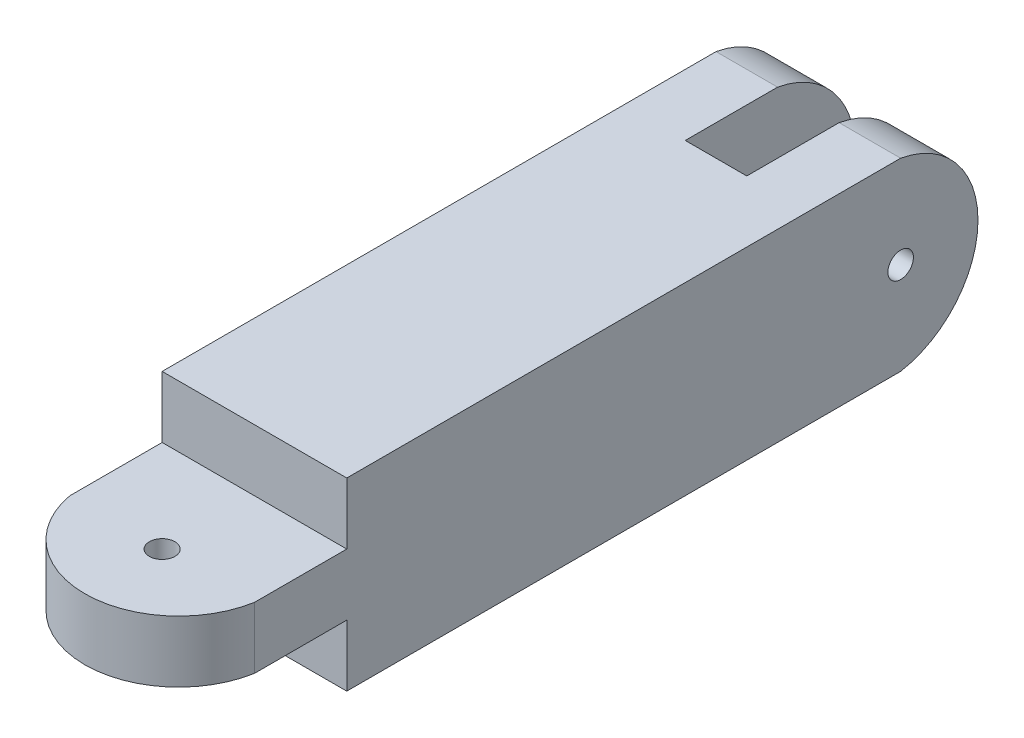
ISO-10303-21;
HEADER;
FILE_DESCRIPTION(('STEP AP214'),'2;1');
FILE_NAME('part.step','',(''),(''),'','','');
FILE_SCHEMA(('AUTOMOTIVE_DESIGN { 1 0 10303 214 1 1 1 1 }'));
ENDSEC;
DATA;
#1=APPLICATION_CONTEXT('core data for automotive mechanical design processes');
#2=APPLICATION_PROTOCOL_DEFINITION('international standard','automotive_design',2000,#1);
#3=PRODUCT_CONTEXT('',#1,'mechanical');
#4=PRODUCT('Part','Part','',(#3));
#5=PRODUCT_RELATED_PRODUCT_CATEGORY('part','',(#4));
#6=PRODUCT_DEFINITION_FORMATION('','',#4);
#7=PRODUCT_DEFINITION_CONTEXT('part definition',#1,'design');
#8=PRODUCT_DEFINITION('design','',#6,#7);
#9=PRODUCT_DEFINITION_SHAPE('','',#8);
#10=(LENGTH_UNIT() NAMED_UNIT(*) SI_UNIT(.MILLI.,.METRE.));
#11=(NAMED_UNIT(*) PLANE_ANGLE_UNIT() SI_UNIT($,.RADIAN.));
#12=(NAMED_UNIT(*) SI_UNIT($,.STERADIAN.) SOLID_ANGLE_UNIT());
#13=UNCERTAINTY_MEASURE_WITH_UNIT(LENGTH_MEASURE(1.E-05),#10,'distance_accuracy_value','');
#14=(GEOMETRIC_REPRESENTATION_CONTEXT(3) GLOBAL_UNCERTAINTY_ASSIGNED_CONTEXT((#13)) GLOBAL_UNIT_ASSIGNED_CONTEXT((#10,
#11,#12)) REPRESENTATION_CONTEXT('',''));
#15=CARTESIAN_POINT('',(0.,0.,0.));
#16=DIRECTION('',(0.,0.,1.));
#17=DIRECTION('',(1.,0.,0.));
#18=AXIS2_PLACEMENT_3D('',#15,#16,#17);
#19=CARTESIAN_POINT('',(0.,0.,150.));
#20=DIRECTION('',(0.,0.,1.));
#21=DIRECTION('',(1.,0.,0.));
#22=AXIS2_PLACEMENT_3D('',#19,#20,#21);
#23=PLANE('',#22);
#24=DIRECTION('',(1.,0.,0.));
#25=VECTOR('',#24,1.);
#26=CARTESIAN_POINT('',(-30.,-10.,150.));
#27=LINE('',#26,#25);
#28=CARTESIAN_POINT('',(-30.,-10.,150.));
#29=VERTEX_POINT('',#28);
#30=CARTESIAN_POINT('',(30.,-10.,150.));
#31=VERTEX_POINT('',#30);
#32=EDGE_CURVE('E56',#29,#31,#27,.T.);
#33=ORIENTED_EDGE('',*,*,#32,.F.);
#34=DIRECTION('',(0.,-1.,0.));
#35=VECTOR('',#34,1.);
#36=CARTESIAN_POINT('',(-30.,30.,150.));
#37=LINE('',#36,#35);
#38=CARTESIAN_POINT('',(-30.,-30.,150.));
#39=VERTEX_POINT('',#38);
#40=EDGE_CURVE('E310',#29,#39,#37,.T.);
#41=ORIENTED_EDGE('',*,*,#40,.T.);
#42=DIRECTION('',(1.,0.,0.));
#43=VECTOR('',#42,1.);
#44=CARTESIAN_POINT('',(-30.,-30.,150.));
#45=LINE('',#44,#43);
#46=CARTESIAN_POINT('',(30.,-30.,150.));
#47=VERTEX_POINT('',#46);
#48=EDGE_CURVE('E314',#39,#47,#45,.T.);
#49=ORIENTED_EDGE('',*,*,#48,.T.);
#50=DIRECTION('',(0.,1.,0.));
#51=VECTOR('',#50,1.);
#52=CARTESIAN_POINT('',(30.,30.,150.));
#53=LINE('',#52,#51);
#54=EDGE_CURVE('E303',#47,#31,#53,.T.);
#55=ORIENTED_EDGE('',*,*,#54,.T.);
#56=EDGE_LOOP('',(#33,#41,#49,#55));
#57=FACE_BOUND('',#56,.T.);
#58=ADVANCED_FACE('F40',(#57),#23,.T.);
#59=CARTESIAN_POINT('',(0.,0.,0.));
#60=DIRECTION('',(0.,0.,1.));
#61=DIRECTION('',(1.,0.,0.));
#62=AXIS2_PLACEMENT_3D('',#59,#60,#61);
#63=PLANE('',#62);
#64=DIRECTION('',(0.,1.,0.));
#65=VECTOR('',#64,1.);
#66=CARTESIAN_POINT('',(9.99999999999999,30.,0.));
#67=LINE('',#66,#65);
#68=CARTESIAN_POINT('',(9.99999999999998,-30.,0.));
#69=VERTEX_POINT('',#68);
#70=CARTESIAN_POINT('',(9.99999999999999,30.,0.));
#71=VERTEX_POINT('',#70);
#72=EDGE_CURVE('E261',#69,#71,#67,.T.);
#73=ORIENTED_EDGE('',*,*,#72,.F.);
#74=DIRECTION('',(1.,0.,0.));
#75=VECTOR('',#74,1.);
#76=CARTESIAN_POINT('',(-30.,-30.,0.));
#77=LINE('',#76,#75);
#78=CARTESIAN_POINT('',(-10.,-30.,0.));
#79=VERTEX_POINT('',#78);
#80=EDGE_CURVE('E320',#79,#69,#77,.T.);
#81=ORIENTED_EDGE('',*,*,#80,.F.);
#82=DIRECTION('',(0.,-1.,0.));
#83=VECTOR('',#82,1.);
#84=CARTESIAN_POINT('',(-10.,-30.,0.));
#85=LINE('',#84,#83);
#86=CARTESIAN_POINT('',(-10.,30.,0.));
#87=VERTEX_POINT('',#86);
#88=EDGE_CURVE('E282',#87,#79,#85,.T.);
#89=ORIENTED_EDGE('',*,*,#88,.F.);
#90=DIRECTION('',(-1.,0.,0.));
#91=VECTOR('',#90,1.);
#92=CARTESIAN_POINT('',(-30.,30.,0.));
#93=LINE('',#92,#91);
#94=EDGE_CURVE('E302',#71,#87,#93,.T.);
#95=ORIENTED_EDGE('',*,*,#94,.F.);
#96=EDGE_LOOP('',(#73,#81,#89,#95));
#97=FACE_BOUND('',#96,.T.);
#98=ADVANCED_FACE('F375',(#97),#63,.F.);
#99=CARTESIAN_POINT('',(30.,30.,150.));
#100=DIRECTION('',(-1.,0.,0.));
#101=DIRECTION('',(0.,-1.,0.));
#102=AXIS2_PLACEMENT_3D('',#99,#100,#101);
#103=PLANE('',#102);
#104=CARTESIAN_POINT('',(30.,0.,-30.));
#105=DIRECTION('',(-1.,0.,0.));
#106=DIRECTION('',(0.,-1.,0.));
#107=AXIS2_PLACEMENT_3D('',#104,#105,#106);
#108=CIRCLE('',#107,4.15);
#109=CARTESIAN_POINT('',(30.,-4.15,-30.));
#110=VERTEX_POINT('',#109);
#111=EDGE_CURVE('E408',#110,#110,#108,.T.);
#112=ORIENTED_EDGE('',*,*,#111,.T.);
#113=EDGE_LOOP('',(#112));
#114=FACE_BOUND('',#113,.T.);
#115=DIRECTION('',(0.,0.,-1.));
#116=VECTOR('',#115,1.);
#117=CARTESIAN_POINT('',(30.,-30.,150.));
#118=LINE('',#117,#116);
#119=CARTESIAN_POINT('',(30.,-30.,-30.));
#120=VERTEX_POINT('',#119);
#121=EDGE_CURVE('E317',#47,#120,#118,.T.);
#122=ORIENTED_EDGE('',*,*,#121,.T.);
#123=CARTESIAN_POINT('',(30.,0.,-24.6688744152853));
#124=DIRECTION('',(1.,0.,0.));
#125=DIRECTION('',(0.,-1.,0.));
#126=AXIS2_PLACEMENT_3D('',#123,#124,#125);
#127=CIRCLE('',#126,30.47);
#128=CARTESIAN_POINT('',(30.,30.,-30.));
#129=VERTEX_POINT('',#128);
#130=EDGE_CURVE('E253',#120,#129,#127,.T.);
#131=ORIENTED_EDGE('',*,*,#130,.T.);
#132=DIRECTION('',(0.,0.,-1.));
#133=VECTOR('',#132,1.);
#134=CARTESIAN_POINT('',(30.,30.,150.));
#135=LINE('',#134,#133);
#136=CARTESIAN_POINT('',(30.,30.,150.));
#137=VERTEX_POINT('',#136);
#138=EDGE_CURVE('E11',#137,#129,#135,.T.);
#139=ORIENTED_EDGE('',*,*,#138,.F.);
#140=CARTESIAN_POINT('',(30.,10.,150.));
#141=VERTEX_POINT('',#140);
#142=EDGE_CURVE('E307',#141,#137,#53,.T.);
#143=ORIENTED_EDGE('',*,*,#142,.F.);
#144=DIRECTION('',(0.,0.,-1.));
#145=VECTOR('',#144,1.);
#146=CARTESIAN_POINT('',(30.,10.,180.));
#147=LINE('',#146,#145);
#148=CARTESIAN_POINT('',(30.,10.,180.));
#149=VERTEX_POINT('',#148);
#150=EDGE_CURVE('E244',#149,#141,#147,.T.);
#151=ORIENTED_EDGE('',*,*,#150,.F.);
#152=DIRECTION('',(0.,1.,0.));
#153=VECTOR('',#152,1.);
#154=CARTESIAN_POINT('',(30.,10.,180.));
#155=LINE('',#154,#153);
#156=CARTESIAN_POINT('',(30.,-10.,180.));
#157=VERTEX_POINT('',#156);
#158=EDGE_CURVE('E220',#157,#149,#155,.T.);
#159=ORIENTED_EDGE('',*,*,#158,.F.);
#160=DIRECTION('',(0.,0.,-1.));
#161=VECTOR('',#160,1.);
#162=CARTESIAN_POINT('',(30.,-10.,180.));
#163=LINE('',#162,#161);
#164=EDGE_CURVE('E228',#157,#31,#163,.T.);
#165=ORIENTED_EDGE('',*,*,#164,.T.);
#166=ORIENTED_EDGE('',*,*,#54,.F.);
#167=EDGE_LOOP('',(#122,#131,#139,#143,#151,#159,#165,#166));
#168=FACE_BOUND('',#167,.T.);
#169=ADVANCED_FACE('F42',(#114,#168),#103,.F.);
#170=CARTESIAN_POINT('',(-30.,30.,150.));
#171=DIRECTION('',(0.,-1.,0.));
#172=DIRECTION('',(0.,0.,-1.));
#173=AXIS2_PLACEMENT_3D('',#170,#171,#172);
#174=PLANE('',#173);
#175=ORIENTED_EDGE('',*,*,#138,.T.);
#176=DIRECTION('',(1.,0.,0.));
#177=VECTOR('',#176,1.);
#178=CARTESIAN_POINT('',(30.,30.,-30.));
#179=LINE('',#178,#177);
#180=CARTESIAN_POINT('',(9.99999999999999,30.,-30.));
#181=VERTEX_POINT('',#180);
#182=EDGE_CURVE('E269',#181,#129,#179,.T.);
#183=ORIENTED_EDGE('',*,*,#182,.F.);
#184=DIRECTION('',(0.,0.,1.));
#185=VECTOR('',#184,1.);
#186=CARTESIAN_POINT('',(9.99999999999999,30.,-30.));
#187=LINE('',#186,#185);
#188=EDGE_CURVE('E273',#181,#71,#187,.T.);
#189=ORIENTED_EDGE('',*,*,#188,.T.);
#190=ORIENTED_EDGE('',*,*,#94,.T.);
#191=DIRECTION('',(0.,0.,1.));
#192=VECTOR('',#191,1.);
#193=CARTESIAN_POINT('',(-10.,30.,-30.));
#194=LINE('',#193,#192);
#195=CARTESIAN_POINT('',(-10.,30.,-30.));
#196=VERTEX_POINT('',#195);
#197=EDGE_CURVE('E298',#196,#87,#194,.T.);
#198=ORIENTED_EDGE('',*,*,#197,.F.);
#199=DIRECTION('',(1.,0.,0.));
#200=VECTOR('',#199,1.);
#201=CARTESIAN_POINT('',(-30.,30.,-30.));
#202=LINE('',#201,#200);
#203=CARTESIAN_POINT('',(-30.,30.,-30.));
#204=VERTEX_POINT('',#203);
#205=EDGE_CURVE('E283',#204,#196,#202,.T.);
#206=ORIENTED_EDGE('',*,*,#205,.F.);
#207=DIRECTION('',(0.,0.,-1.));
#208=VECTOR('',#207,1.);
#209=CARTESIAN_POINT('',(-30.,30.,150.));
#210=LINE('',#209,#208);
#211=CARTESIAN_POINT('',(-30.,30.,150.));
#212=VERTEX_POINT('',#211);
#213=EDGE_CURVE('E49',#212,#204,#210,.T.);
#214=ORIENTED_EDGE('',*,*,#213,.F.);
#215=DIRECTION('',(-1.,0.,0.));
#216=VECTOR('',#215,1.);
#217=CARTESIAN_POINT('',(-30.,30.,150.));
#218=LINE('',#217,#216);
#219=EDGE_CURVE('E306',#137,#212,#218,.T.);
#220=ORIENTED_EDGE('',*,*,#219,.F.);
#221=EDGE_LOOP('',(#175,#183,#189,#190,#198,#206,#214,#220));
#222=FACE_BOUND('',#221,.T.);
#223=ADVANCED_FACE('F362',(#222),#174,.F.);
#224=CARTESIAN_POINT('',(-30.,30.,150.));
#225=DIRECTION('',(1.,0.,0.));
#226=DIRECTION('',(0.,1.,0.));
#227=AXIS2_PLACEMENT_3D('',#224,#225,#226);
#228=PLANE('',#227);
#229=CARTESIAN_POINT('',(-30.,0.,-30.));
#230=DIRECTION('',(1.,0.,0.));
#231=DIRECTION('',(0.,1.,0.));
#232=AXIS2_PLACEMENT_3D('',#229,#230,#231);
#233=CIRCLE('',#232,4.15);
#234=CARTESIAN_POINT('',(-30.,4.15,-30.));
#235=VERTEX_POINT('',#234);
#236=EDGE_CURVE('E417',#235,#235,#233,.T.);
#237=ORIENTED_EDGE('',*,*,#236,.T.);
#238=EDGE_LOOP('',(#237));
#239=FACE_BOUND('',#238,.T.);
#240=ORIENTED_EDGE('',*,*,#213,.T.);
#241=CARTESIAN_POINT('',(-30.,0.,-24.6688744152853));
#242=DIRECTION('',(-1.,0.,0.));
#243=DIRECTION('',(0.,1.,0.));
#244=AXIS2_PLACEMENT_3D('',#241,#242,#243);
#245=CIRCLE('',#244,30.47);
#246=CARTESIAN_POINT('',(-30.,-30.,-30.));
#247=VERTEX_POINT('',#246);
#248=EDGE_CURVE('E248',#204,#247,#245,.T.);
#249=ORIENTED_EDGE('',*,*,#248,.T.);
#250=DIRECTION('',(0.,0.,-1.));
#251=VECTOR('',#250,1.);
#252=CARTESIAN_POINT('',(-30.,-30.,150.));
#253=LINE('',#252,#251);
#254=EDGE_CURVE('E327',#39,#247,#253,.T.);
#255=ORIENTED_EDGE('',*,*,#254,.F.);
#256=ORIENTED_EDGE('',*,*,#40,.F.);
#257=DIRECTION('',(0.,0.,-1.));
#258=VECTOR('',#257,1.);
#259=CARTESIAN_POINT('',(-30.,-10.,180.));
#260=LINE('',#259,#258);
#261=CARTESIAN_POINT('',(-30.,-10.,180.));
#262=VERTEX_POINT('',#261);
#263=EDGE_CURVE('E236',#262,#29,#260,.T.);
#264=ORIENTED_EDGE('',*,*,#263,.F.);
#265=DIRECTION('',(0.,-1.,0.));
#266=VECTOR('',#265,1.);
#267=CARTESIAN_POINT('',(-30.,10.,180.));
#268=LINE('',#267,#266);
#269=CARTESIAN_POINT('',(-30.,10.,180.));
#270=VERTEX_POINT('',#269);
#271=EDGE_CURVE('E224',#270,#262,#268,.T.);
#272=ORIENTED_EDGE('',*,*,#271,.F.);
#273=DIRECTION('',(0.,0.,-1.));
#274=VECTOR('',#273,1.);
#275=CARTESIAN_POINT('',(-30.,10.,180.));
#276=LINE('',#275,#274);
#277=CARTESIAN_POINT('',(-30.,10.,150.));
#278=VERTEX_POINT('',#277);
#279=EDGE_CURVE('E240',#270,#278,#276,.T.);
#280=ORIENTED_EDGE('',*,*,#279,.T.);
#281=EDGE_CURVE('E311',#212,#278,#37,.T.);
#282=ORIENTED_EDGE('',*,*,#281,.F.);
#283=EDGE_LOOP('',(#240,#249,#255,#256,#264,#272,#280,#282));
#284=FACE_BOUND('',#283,.T.);
#285=ADVANCED_FACE('F335',(#239,#284),#228,.F.);
#286=CARTESIAN_POINT('',(-30.,-30.,150.));
#287=DIRECTION('',(0.,1.,0.));
#288=DIRECTION('',(0.,0.,1.));
#289=AXIS2_PLACEMENT_3D('',#286,#287,#288);
#290=PLANE('',#289);
#291=ORIENTED_EDGE('',*,*,#254,.T.);
#292=DIRECTION('',(-1.,0.,0.));
#293=VECTOR('',#292,1.);
#294=CARTESIAN_POINT('',(-30.,-30.,-30.));
#295=LINE('',#294,#293);
#296=CARTESIAN_POINT('',(-10.,-30.,-30.));
#297=VERTEX_POINT('',#296);
#298=EDGE_CURVE('E287',#297,#247,#295,.T.);
#299=ORIENTED_EDGE('',*,*,#298,.F.);
#300=DIRECTION('',(0.,0.,1.));
#301=VECTOR('',#300,1.);
#302=CARTESIAN_POINT('',(-10.,-30.,-30.));
#303=LINE('',#302,#301);
#304=EDGE_CURVE('E291',#297,#79,#303,.T.);
#305=ORIENTED_EDGE('',*,*,#304,.T.);
#306=ORIENTED_EDGE('',*,*,#80,.T.);
#307=DIRECTION('',(0.,0.,1.));
#308=VECTOR('',#307,1.);
#309=CARTESIAN_POINT('',(9.99999999999998,-30.,-30.));
#310=LINE('',#309,#308);
#311=CARTESIAN_POINT('',(9.99999999999998,-30.,-30.));
#312=VERTEX_POINT('',#311);
#313=EDGE_CURVE('E279',#312,#69,#310,.T.);
#314=ORIENTED_EDGE('',*,*,#313,.F.);
#315=DIRECTION('',(-1.,0.,0.));
#316=VECTOR('',#315,1.);
#317=CARTESIAN_POINT('',(30.,-30.,-30.));
#318=LINE('',#317,#316);
#319=EDGE_CURVE('E265',#120,#312,#318,.T.);
#320=ORIENTED_EDGE('',*,*,#319,.F.);
#321=ORIENTED_EDGE('',*,*,#121,.F.);
#322=ORIENTED_EDGE('',*,*,#48,.F.);
#323=EDGE_LOOP('',(#291,#299,#305,#306,#314,#320,#321,#322));
#324=FACE_BOUND('',#323,.T.);
#325=ADVANCED_FACE('F344',(#324),#290,.F.);
#326=DIRECTION('',(-1.,0.,0.));
#327=VECTOR('',#326,1.);
#328=CARTESIAN_POINT('',(-30.,10.,150.));
#329=LINE('',#328,#327);
#330=EDGE_CURVE('E64',#141,#278,#329,.T.);
#331=ORIENTED_EDGE('',*,*,#330,.F.);
#332=ORIENTED_EDGE('',*,*,#142,.T.);
#333=ORIENTED_EDGE('',*,*,#219,.T.);
#334=ORIENTED_EDGE('',*,*,#281,.T.);
#335=EDGE_LOOP('',(#331,#332,#333,#334));
#336=FACE_BOUND('',#335,.T.);
#337=ADVANCED_FACE('F361',(#336),#23,.T.);
#338=CARTESIAN_POINT('',(-10.,-30.,-30.));
#339=DIRECTION('',(-1.,0.,0.));
#340=DIRECTION('',(0.,-1.,0.));
#341=AXIS2_PLACEMENT_3D('',#338,#339,#340);
#342=PLANE('',#341);
#343=CARTESIAN_POINT('',(-10.,0.,-30.));
#344=DIRECTION('',(1.,0.,0.));
#345=DIRECTION('',(0.,1.,0.));
#346=AXIS2_PLACEMENT_3D('',#343,#344,#345);
#347=CIRCLE('',#346,4.15);
#348=CARTESIAN_POINT('',(-10.,4.15,-30.));
#349=VERTEX_POINT('',#348);
#350=EDGE_CURVE('E420',#349,#349,#347,.T.);
#351=ORIENTED_EDGE('',*,*,#350,.F.);
#352=EDGE_LOOP('',(#351));
#353=FACE_BOUND('',#352,.T.);
#354=ORIENTED_EDGE('',*,*,#88,.T.);
#355=ORIENTED_EDGE('',*,*,#304,.F.);
#356=CARTESIAN_POINT('',(-10.,0.,-24.6688744152853));
#357=DIRECTION('',(-1.,0.,0.));
#358=DIRECTION('',(0.,1.,0.));
#359=AXIS2_PLACEMENT_3D('',#356,#357,#358);
#360=CIRCLE('',#359,30.47);
#361=EDGE_CURVE('E249',#196,#297,#360,.T.);
#362=ORIENTED_EDGE('',*,*,#361,.F.);
#363=ORIENTED_EDGE('',*,*,#197,.T.);
#364=EDGE_LOOP('',(#354,#355,#362,#363));
#365=FACE_BOUND('',#364,.T.);
#366=ADVANCED_FACE('F377',(#353,#365),#342,.F.);
#367=CARTESIAN_POINT('',(9.99999999999999,30.,-30.));
#368=DIRECTION('',(1.,0.,0.));
#369=DIRECTION('',(0.,1.,0.));
#370=AXIS2_PLACEMENT_3D('',#367,#368,#369);
#371=PLANE('',#370);
#372=CARTESIAN_POINT('',(9.99999999999999,0.,-30.));
#373=DIRECTION('',(-1.,0.,0.));
#374=DIRECTION('',(0.,-1.,0.));
#375=AXIS2_PLACEMENT_3D('',#372,#373,#374);
#376=CIRCLE('',#375,4.15);
#377=CARTESIAN_POINT('',(9.99999999999999,-4.15,-30.));
#378=VERTEX_POINT('',#377);
#379=EDGE_CURVE('E411',#378,#378,#376,.T.);
#380=ORIENTED_EDGE('',*,*,#379,.F.);
#381=EDGE_LOOP('',(#380));
#382=FACE_BOUND('',#381,.T.);
#383=ORIENTED_EDGE('',*,*,#72,.T.);
#384=ORIENTED_EDGE('',*,*,#188,.F.);
#385=CARTESIAN_POINT('',(10.,0.,-24.6688744152853));
#386=DIRECTION('',(1.,0.,0.));
#387=DIRECTION('',(0.,-1.,0.));
#388=AXIS2_PLACEMENT_3D('',#385,#386,#387);
#389=CIRCLE('',#388,30.47);
#390=EDGE_CURVE('E257',#312,#181,#389,.T.);
#391=ORIENTED_EDGE('',*,*,#390,.F.);
#392=ORIENTED_EDGE('',*,*,#313,.T.);
#393=EDGE_LOOP('',(#383,#384,#391,#392));
#394=FACE_BOUND('',#393,.T.);
#395=ADVANCED_FACE('F370',(#382,#394),#371,.F.);
#396=CARTESIAN_POINT('',(10.,0.,-24.6688744152853));
#397=DIRECTION('',(1.,0.,0.));
#398=DIRECTION('',(0.,1.,0.));
#399=AXIS2_PLACEMENT_3D('',#396,#397,#398);
#400=CYLINDRICAL_SURFACE('',#399,30.47);
#401=ORIENTED_EDGE('',*,*,#130,.F.);
#402=ORIENTED_EDGE('',*,*,#319,.T.);
#403=ORIENTED_EDGE('',*,*,#390,.T.);
#404=ORIENTED_EDGE('',*,*,#182,.T.);
#405=EDGE_LOOP('',(#401,#402,#403,#404));
#406=FACE_BOUND('',#405,.T.);
#407=ADVANCED_FACE('F366',(#406),#400,.T.);
#408=CARTESIAN_POINT('',(-10.,0.,-24.6688744152853));
#409=DIRECTION('',(-1.,0.,0.));
#410=DIRECTION('',(0.,-1.,0.));
#411=AXIS2_PLACEMENT_3D('',#408,#409,#410);
#412=CYLINDRICAL_SURFACE('',#411,30.47);
#413=ORIENTED_EDGE('',*,*,#248,.F.);
#414=ORIENTED_EDGE('',*,*,#205,.T.);
#415=ORIENTED_EDGE('',*,*,#361,.T.);
#416=ORIENTED_EDGE('',*,*,#298,.T.);
#417=EDGE_LOOP('',(#413,#414,#415,#416));
#418=FACE_BOUND('',#417,.T.);
#419=ADVANCED_FACE('F340',(#418),#412,.T.);
#420=CARTESIAN_POINT('',(-30.,10.,180.));
#421=DIRECTION('',(0.,-1.,0.));
#422=DIRECTION('',(0.,0.,-1.));
#423=AXIS2_PLACEMENT_3D('',#420,#421,#422);
#424=PLANE('',#423);
#425=CARTESIAN_POINT('',(0.,9.99999999999999,180.));
#426=DIRECTION('',(0.,-1.,0.));
#427=DIRECTION('',(0.,0.,-1.));
#428=AXIS2_PLACEMENT_3D('',#425,#426,#427);
#429=CIRCLE('',#428,4.14999999999999);
#430=CARTESIAN_POINT('',(0.,9.99999999999999,175.85));
#431=VERTEX_POINT('',#430);
#432=EDGE_CURVE('E182',#431,#431,#429,.T.);
#433=ORIENTED_EDGE('',*,*,#432,.T.);
#434=EDGE_LOOP('',(#433));
#435=FACE_BOUND('',#434,.T.);
#436=ORIENTED_EDGE('',*,*,#330,.T.);
#437=ORIENTED_EDGE('',*,*,#279,.F.);
#438=CARTESIAN_POINT('',(0.,10.,174.668874415285));
#439=DIRECTION('',(0.,1.,0.));
#440=DIRECTION('',(0.,0.,-1.));
#441=AXIS2_PLACEMENT_3D('',#438,#439,#440);
#442=CIRCLE('',#441,30.47);
#443=EDGE_CURVE('E207',#270,#149,#442,.T.);
#444=ORIENTED_EDGE('',*,*,#443,.T.);
#445=ORIENTED_EDGE('',*,*,#150,.T.);
#446=EDGE_LOOP('',(#436,#437,#444,#445));
#447=FACE_BOUND('',#446,.T.);
#448=ADVANCED_FACE('F357',(#435,#447),#424,.F.);
#449=CARTESIAN_POINT('',(-30.,-10.,180.));
#450=DIRECTION('',(0.,1.,0.));
#451=DIRECTION('',(0.,0.,1.));
#452=AXIS2_PLACEMENT_3D('',#449,#450,#451);
#453=PLANE('',#452);
#454=CARTESIAN_POINT('',(0.,-10.,180.));
#455=DIRECTION('',(0.,-1.,0.));
#456=DIRECTION('',(0.,0.,-1.));
#457=AXIS2_PLACEMENT_3D('',#454,#455,#456);
#458=CIRCLE('',#457,4.14999999999999);
#459=CARTESIAN_POINT('',(0.,-10.,175.85));
#460=VERTEX_POINT('',#459);
#461=EDGE_CURVE('E186',#460,#460,#458,.T.);
#462=ORIENTED_EDGE('',*,*,#461,.F.);
#463=EDGE_LOOP('',(#462));
#464=FACE_BOUND('',#463,.T.);
#465=ORIENTED_EDGE('',*,*,#32,.T.);
#466=ORIENTED_EDGE('',*,*,#164,.F.);
#467=CARTESIAN_POINT('',(0.,-10.,174.668874415285));
#468=DIRECTION('',(0.,1.,0.));
#469=DIRECTION('',(0.,0.,-1.));
#470=AXIS2_PLACEMENT_3D('',#467,#468,#469);
#471=CIRCLE('',#470,30.47);
#472=EDGE_CURVE('E213',#262,#157,#471,.T.);
#473=ORIENTED_EDGE('',*,*,#472,.F.);
#474=ORIENTED_EDGE('',*,*,#263,.T.);
#475=EDGE_LOOP('',(#465,#466,#473,#474));
#476=FACE_BOUND('',#475,.T.);
#477=ADVANCED_FACE('F350',(#464,#476),#453,.F.);
#478=CARTESIAN_POINT('',(0.,-10.,174.668874415285));
#479=DIRECTION('',(0.,1.,0.));
#480=DIRECTION('',(0.,0.,1.));
#481=AXIS2_PLACEMENT_3D('',#478,#479,#480);
#482=CYLINDRICAL_SURFACE('',#481,30.47);
#483=ORIENTED_EDGE('',*,*,#443,.F.);
#484=ORIENTED_EDGE('',*,*,#271,.T.);
#485=ORIENTED_EDGE('',*,*,#472,.T.);
#486=ORIENTED_EDGE('',*,*,#158,.T.);
#487=EDGE_LOOP('',(#483,#484,#485,#486));
#488=FACE_BOUND('',#487,.T.);
#489=ADVANCED_FACE('F354',(#488),#482,.T.);
#490=CARTESIAN_POINT('',(0.,120.,180.));
#491=DIRECTION('',(0.,-1.,0.));
#492=DIRECTION('',(0.,0.,-1.));
#493=AXIS2_PLACEMENT_3D('',#490,#491,#492);
#494=CYLINDRICAL_SURFACE('',#493,4.14999999999999);
#495=ORIENTED_EDGE('',*,*,#461,.T.);
#496=EDGE_LOOP('',(#495));
#497=FACE_BOUND('',#496,.T.);
#498=ORIENTED_EDGE('',*,*,#432,.F.);
#499=EDGE_LOOP('',(#498));
#500=FACE_BOUND('',#499,.T.);
#501=ADVANCED_FACE('F437',(#497,#500),#494,.F.);
#502=CARTESIAN_POINT('',(30.,0.,-30.));
#503=DIRECTION('',(-1.,0.,0.));
#504=DIRECTION('',(0.,-1.,0.));
#505=AXIS2_PLACEMENT_3D('',#502,#503,#504);
#506=CYLINDRICAL_SURFACE('',#505,4.15);
#507=ORIENTED_EDGE('',*,*,#111,.F.);
#508=EDGE_LOOP('',(#507));
#509=FACE_BOUND('',#508,.T.);
#510=ORIENTED_EDGE('',*,*,#379,.T.);
#511=EDGE_LOOP('',(#510));
#512=FACE_BOUND('',#511,.T.);
#513=ADVANCED_FACE('F431',(#509,#512),#506,.F.);
#514=CARTESIAN_POINT('',(-30.,0.,-30.));
#515=DIRECTION('',(1.,0.,0.));
#516=DIRECTION('',(0.,1.,0.));
#517=AXIS2_PLACEMENT_3D('',#514,#515,#516);
#518=CYLINDRICAL_SURFACE('',#517,4.15);
#519=ORIENTED_EDGE('',*,*,#236,.F.);
#520=EDGE_LOOP('',(#519));
#521=FACE_BOUND('',#520,.T.);
#522=ORIENTED_EDGE('',*,*,#350,.T.);
#523=EDGE_LOOP('',(#522));
#524=FACE_BOUND('',#523,.T.);
#525=ADVANCED_FACE('F428',(#521,#524),#518,.F.);
#526=CLOSED_SHELL('',(#58,#98,#169,#223,#285,#325,#337,#366,#395,#407,#419,#448,#477,#489,#501,
#513,#525));
#527=CARTESIAN_POINT('',(-25.25,-25.25,145.));
#528=DIRECTION('',(-1.,0.,0.));
#529=DIRECTION('',(0.,0.,1.));
#530=AXIS2_PLACEMENT_3D('',#527,#528,#529);
#531=PLANE('',#530);
#532=DIRECTION('',(0.,0.,-1.));
#533=VECTOR('',#532,1.);
#534=CARTESIAN_POINT('',(-25.25,25.25,145.));
#535=LINE('',#534,#533);
#536=CARTESIAN_POINT('',(-25.25,25.25,145.));
#537=VERTEX_POINT('',#536);
#538=CARTESIAN_POINT('',(-25.25,25.25,9.9999999999999));
#539=VERTEX_POINT('',#538);
#540=EDGE_CURVE('E153',#537,#539,#535,.T.);
#541=ORIENTED_EDGE('',*,*,#540,.F.);
#542=DIRECTION('',(0.,1.,0.));
#543=VECTOR('',#542,1.);
#544=CARTESIAN_POINT('',(-25.25,-25.25,145.));
#545=LINE('',#544,#543);
#546=CARTESIAN_POINT('',(-25.25,-25.25,145.));
#547=VERTEX_POINT('',#546);
#548=EDGE_CURVE('E195',#547,#537,#545,.T.);
#549=ORIENTED_EDGE('',*,*,#548,.F.);
#550=DIRECTION('',(0.,0.,-1.));
#551=VECTOR('',#550,1.);
#552=CARTESIAN_POINT('',(-25.25,-25.25,145.));
#553=LINE('',#552,#551);
#554=CARTESIAN_POINT('',(-25.25,-25.25,9.9999999999999));
#555=VERTEX_POINT('',#554);
#556=EDGE_CURVE('E180',#547,#555,#553,.T.);
#557=ORIENTED_EDGE('',*,*,#556,.T.);
#558=DIRECTION('',(0.,1.,0.));
#559=VECTOR('',#558,1.);
#560=CARTESIAN_POINT('',(-25.25,-25.25,9.9999999999999));
#561=LINE('',#560,#559);
#562=EDGE_CURVE('E173',#555,#539,#561,.T.);
#563=ORIENTED_EDGE('',*,*,#562,.T.);
#564=EDGE_LOOP('',(#541,#549,#557,#563));
#565=FACE_BOUND('',#564,.T.);
#566=ADVANCED_FACE('F179',(#565),#531,.F.);
#567=CARTESIAN_POINT('',(-25.25,-25.25,145.));
#568=DIRECTION('',(0.,1.,0.));
#569=DIRECTION('',(0.,0.,1.));
#570=AXIS2_PLACEMENT_3D('',#567,#568,#569);
#571=PLANE('',#570);
#572=ORIENTED_EDGE('',*,*,#556,.F.);
#573=DIRECTION('',(1.,0.,0.));
#574=VECTOR('',#573,1.);
#575=CARTESIAN_POINT('',(-25.25,-25.25,145.));
#576=LINE('',#575,#574);
#577=CARTESIAN_POINT('',(25.25,-25.25,145.));
#578=VERTEX_POINT('',#577);
#579=EDGE_CURVE('E167',#547,#578,#576,.T.);
#580=ORIENTED_EDGE('',*,*,#579,.T.);
#581=DIRECTION('',(0.,0.,-1.));
#582=VECTOR('',#581,1.);
#583=CARTESIAN_POINT('',(25.25,-25.25,145.));
#584=LINE('',#583,#582);
#585=CARTESIAN_POINT('',(25.25,-25.25,9.9999999999999));
#586=VERTEX_POINT('',#585);
#587=EDGE_CURVE('E208',#578,#586,#584,.T.);
#588=ORIENTED_EDGE('',*,*,#587,.T.);
#589=DIRECTION('',(1.,0.,0.));
#590=VECTOR('',#589,1.);
#591=CARTESIAN_POINT('',(-25.25,-25.25,9.9999999999999));
#592=LINE('',#591,#590);
#593=EDGE_CURVE('E192',#555,#586,#592,.T.);
#594=ORIENTED_EDGE('',*,*,#593,.F.);
#595=EDGE_LOOP('',(#572,#580,#588,#594));
#596=FACE_BOUND('',#595,.T.);
#597=ADVANCED_FACE('F450',(#596),#571,.T.);
#598=CARTESIAN_POINT('',(25.25,-25.25,145.));
#599=DIRECTION('',(-1.,0.,0.));
#600=DIRECTION('',(0.,0.,1.));
#601=AXIS2_PLACEMENT_3D('',#598,#599,#600);
#602=PLANE('',#601);
#603=ORIENTED_EDGE('',*,*,#587,.F.);
#604=DIRECTION('',(0.,1.,0.));
#605=VECTOR('',#604,1.);
#606=CARTESIAN_POINT('',(25.25,-25.25,145.));
#607=LINE('',#606,#605);
#608=CARTESIAN_POINT('',(25.25,25.25,145.));
#609=VERTEX_POINT('',#608);
#610=EDGE_CURVE('E200',#578,#609,#607,.T.);
#611=ORIENTED_EDGE('',*,*,#610,.T.);
#612=DIRECTION('',(0.,0.,-1.));
#613=VECTOR('',#612,1.);
#614=CARTESIAN_POINT('',(25.25,25.25,145.));
#615=LINE('',#614,#613);
#616=CARTESIAN_POINT('',(25.25,25.25,9.9999999999999));
#617=VERTEX_POINT('',#616);
#618=EDGE_CURVE('E166',#609,#617,#615,.T.);
#619=ORIENTED_EDGE('',*,*,#618,.T.);
#620=DIRECTION('',(0.,1.,0.));
#621=VECTOR('',#620,1.);
#622=CARTESIAN_POINT('',(25.25,-25.25,9.9999999999999));
#623=LINE('',#622,#621);
#624=EDGE_CURVE('E176',#586,#617,#623,.T.);
#625=ORIENTED_EDGE('',*,*,#624,.F.);
#626=EDGE_LOOP('',(#603,#611,#619,#625));
#627=FACE_BOUND('',#626,.T.);
#628=ADVANCED_FACE('F453',(#627),#602,.T.);
#629=CARTESIAN_POINT('',(-25.25,25.25,145.));
#630=DIRECTION('',(0.,1.,0.));
#631=DIRECTION('',(0.,0.,1.));
#632=AXIS2_PLACEMENT_3D('',#629,#630,#631);
#633=PLANE('',#632);
#634=ORIENTED_EDGE('',*,*,#618,.F.);
#635=DIRECTION('',(1.,0.,0.));
#636=VECTOR('',#635,1.);
#637=CARTESIAN_POINT('',(-25.25,25.25,145.));
#638=LINE('',#637,#636);
#639=EDGE_CURVE('E160',#537,#609,#638,.T.);
#640=ORIENTED_EDGE('',*,*,#639,.F.);
#641=ORIENTED_EDGE('',*,*,#540,.T.);
#642=DIRECTION('',(1.,0.,0.));
#643=VECTOR('',#642,1.);
#644=CARTESIAN_POINT('',(-25.25,25.25,9.9999999999999));
#645=LINE('',#644,#643);
#646=EDGE_CURVE('E157',#539,#617,#645,.T.);
#647=ORIENTED_EDGE('',*,*,#646,.T.);
#648=EDGE_LOOP('',(#634,#640,#641,#647));
#649=FACE_BOUND('',#648,.T.);
#650=ADVANCED_FACE('F156',(#649),#633,.F.);
#651=CARTESIAN_POINT('',(0.,0.,145.));
#652=DIRECTION('',(0.,0.,-1.));
#653=DIRECTION('',(-1.,0.,0.));
#654=AXIS2_PLACEMENT_3D('',#651,#652,#653);
#655=PLANE('',#654);
#656=ORIENTED_EDGE('',*,*,#548,.T.);
#657=ORIENTED_EDGE('',*,*,#639,.T.);
#658=ORIENTED_EDGE('',*,*,#610,.F.);
#659=ORIENTED_EDGE('',*,*,#579,.F.);
#660=EDGE_LOOP('',(#656,#657,#658,#659));
#661=FACE_BOUND('',#660,.T.);
#662=ADVANCED_FACE('F445',(#661),#655,.T.);
#663=CARTESIAN_POINT('',(0.,0.,9.9999999999999));
#664=DIRECTION('',(0.,0.,-1.));
#665=DIRECTION('',(-1.,0.,0.));
#666=AXIS2_PLACEMENT_3D('',#663,#664,#665);
#667=PLANE('',#666);
#668=ORIENTED_EDGE('',*,*,#562,.F.);
#669=ORIENTED_EDGE('',*,*,#593,.T.);
#670=ORIENTED_EDGE('',*,*,#624,.T.);
#671=ORIENTED_EDGE('',*,*,#646,.F.);
#672=EDGE_LOOP('',(#668,#669,#670,#671));
#673=FACE_BOUND('',#672,.T.);
#674=ADVANCED_FACE('F171',(#673),#667,.F.);
#675=CLOSED_SHELL('',(#566,#597,#628,#650,#662,#674));
#676=ORIENTED_CLOSED_SHELL('',*,#675,.T.);
#677=BREP_WITH_VOIDS('B2',#526,(#676));
#678=ADVANCED_BREP_SHAPE_REPRESENTATION('',(#18,#677),#14);
#679=SHAPE_DEFINITION_REPRESENTATION(#9,#678);
ENDSEC;
END-ISO-10303-21;
